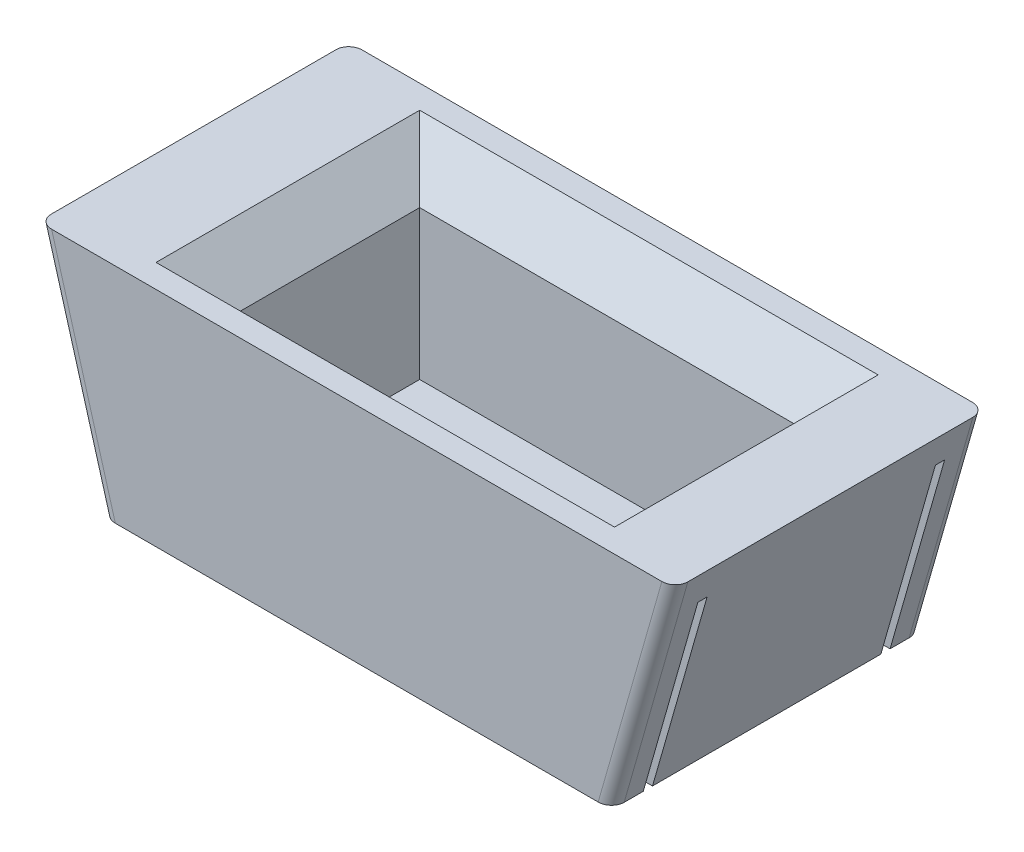
ISO-10303-21;
HEADER;
FILE_DESCRIPTION(('STEP AP214'),'2;1');
FILE_NAME('part.step','',(''),(''),'','','');
FILE_SCHEMA(('AUTOMOTIVE_DESIGN { 1 0 10303 214 1 1 1 1 }'));
ENDSEC;
DATA;
#1=APPLICATION_CONTEXT('core data for automotive mechanical design processes');
#2=APPLICATION_PROTOCOL_DEFINITION('international standard','automotive_design',2000,#1);
#3=PRODUCT_CONTEXT('',#1,'mechanical');
#4=PRODUCT('Part','Part','',(#3));
#5=PRODUCT_RELATED_PRODUCT_CATEGORY('part','',(#4));
#6=PRODUCT_DEFINITION_FORMATION('','',#4);
#7=PRODUCT_DEFINITION_CONTEXT('part definition',#1,'design');
#8=PRODUCT_DEFINITION('design','',#6,#7);
#9=PRODUCT_DEFINITION_SHAPE('','',#8);
#10=(LENGTH_UNIT() NAMED_UNIT(*) SI_UNIT(.MILLI.,.METRE.));
#11=(NAMED_UNIT(*) PLANE_ANGLE_UNIT() SI_UNIT($,.RADIAN.));
#12=(NAMED_UNIT(*) SI_UNIT($,.STERADIAN.) SOLID_ANGLE_UNIT());
#13=UNCERTAINTY_MEASURE_WITH_UNIT(LENGTH_MEASURE(1.E-05),#10,'distance_accuracy_value','');
#14=(GEOMETRIC_REPRESENTATION_CONTEXT(3) GLOBAL_UNCERTAINTY_ASSIGNED_CONTEXT((#13)) GLOBAL_UNIT_ASSIGNED_CONTEXT((#10,
#11,#12)) REPRESENTATION_CONTEXT('',''));
#15=CARTESIAN_POINT('',(0.,0.,0.));
#16=DIRECTION('',(0.,0.,1.));
#17=DIRECTION('',(1.,0.,0.));
#18=AXIS2_PLACEMENT_3D('',#15,#16,#17);
#19=CARTESIAN_POINT('',(0.,0.,0.));
#20=DIRECTION('',(0.,1.,0.));
#21=DIRECTION('',(0.,0.,1.));
#22=AXIS2_PLACEMENT_3D('',#19,#20,#21);
#23=PLANE('',#22);
#24=DIRECTION('',(0.,0.,1.));
#25=VECTOR('',#24,1.);
#26=CARTESIAN_POINT('',(-7.7566470171623,0.,11.5914147439107));
#27=LINE('',#26,#25);
#28=CARTESIAN_POINT('',(-7.7566470171623,0.,-14.1314147439107));
#29=VERTEX_POINT('',#28);
#30=CARTESIAN_POINT('',(-7.7566470171623,0.,14.1314147439107));
#31=VERTEX_POINT('',#30);
#32=EDGE_CURVE('E533',#29,#31,#27,.T.);
#33=ORIENTED_EDGE('',*,*,#32,.T.);
#34=DIRECTION('',(1.,0.,0.));
#35=VECTOR('',#34,1.);
#36=CARTESIAN_POINT('',(0.,0.,14.1314147439107));
#37=LINE('',#36,#35);
#38=CARTESIAN_POINT('',(32.766,0.,14.1314147439107));
#39=VERTEX_POINT('',#38);
#40=EDGE_CURVE('E536',#31,#39,#37,.T.);
#41=ORIENTED_EDGE('',*,*,#40,.T.);
#42=DIRECTION('',(0.,0.,-1.));
#43=VECTOR('',#42,1.);
#44=CARTESIAN_POINT('',(32.766,0.,0.));
#45=LINE('',#44,#43);
#46=CARTESIAN_POINT('',(32.766,0.,-14.1314147439107));
#47=VERTEX_POINT('',#46);
#48=EDGE_CURVE('E530',#39,#47,#45,.T.);
#49=ORIENTED_EDGE('',*,*,#48,.T.);
#50=DIRECTION('',(-1.,0.,0.));
#51=VECTOR('',#50,1.);
#52=CARTESIAN_POINT('',(-5.21664701716227,0.,-14.1314147439107));
#53=LINE('',#52,#51);
#54=EDGE_CURVE('E527',#47,#29,#53,.T.);
#55=ORIENTED_EDGE('',*,*,#54,.T.);
#56=EDGE_LOOP('',(#33,#41,#49,#55));
#57=FACE_BOUND('',#56,.T.);
#58=DIRECTION('',(1.,0.,0.));
#59=VECTOR('',#58,1.);
#60=CARTESIAN_POINT('',(0.,0.,22.7711));
#61=LINE('',#60,#59);
#62=CARTESIAN_POINT('',(-50.7954767943513,0.,22.7711));
#63=VERTEX_POINT('',#62);
#64=CARTESIAN_POINT('',(50.7954767943513,0.,22.7711));
#65=VERTEX_POINT('',#64);
#66=EDGE_CURVE('E386',#63,#65,#61,.T.);
#67=ORIENTED_EDGE('',*,*,#66,.F.);
#68=DIRECTION('',(0.,0.,1.));
#69=VECTOR('',#68,1.);
#70=CARTESIAN_POINT('',(-50.7954767943513,0.,-30.9626));
#71=LINE('',#70,#69);
#72=CARTESIAN_POINT('',(-50.7954767943513,0.,-22.7711));
#73=VERTEX_POINT('',#72);
#74=EDGE_CURVE('E327',#73,#63,#71,.T.);
#75=ORIENTED_EDGE('',*,*,#74,.F.);
#76=DIRECTION('',(1.,0.,0.));
#77=VECTOR('',#76,1.);
#78=CARTESIAN_POINT('',(0.,0.,-22.7711));
#79=LINE('',#78,#77);
#80=CARTESIAN_POINT('',(50.7954767943513,0.,-22.7711));
#81=VERTEX_POINT('',#80);
#82=EDGE_CURVE('E397',#73,#81,#79,.T.);
#83=ORIENTED_EDGE('',*,*,#82,.T.);
#84=DIRECTION('',(0.,0.,1.));
#85=VECTOR('',#84,1.);
#86=CARTESIAN_POINT('',(50.7954767943513,0.,-30.9626));
#87=LINE('',#86,#85);
#88=EDGE_CURVE('E332',#81,#65,#87,.T.);
#89=ORIENTED_EDGE('',*,*,#88,.T.);
#90=EDGE_LOOP('',(#67,#75,#83,#89));
#91=FACE_BOUND('',#90,.T.);
#92=ADVANCED_FACE('F76',(#57,#91),#23,.F.);
#93=DIRECTION('',(1.,0.,0.));
#94=VECTOR('',#93,1.);
#95=CARTESIAN_POINT('',(0.,0.,30.9626));
#96=LINE('',#95,#94);
#97=CARTESIAN_POINT('',(-48.1537659016846,0.,30.9626));
#98=VERTEX_POINT('',#97);
#99=CARTESIAN_POINT('',(48.1537659016846,0.,30.9626));
#100=VERTEX_POINT('',#99);
#101=EDGE_CURVE('E396',#98,#100,#96,.T.);
#102=ORIENTED_EDGE('',*,*,#101,.F.);
#103=CARTESIAN_POINT('',(-48.1537659016846,0.,28.4226));
#104=DIRECTION('',(0.,1.,0.));
#105=DIRECTION('',(-1.,0.,0.));
#106=AXIS2_PLACEMENT_3D('',#103,#104,#105);
#107=ELLIPSE('',#106,2.64171089266669,2.54);
#108=CARTESIAN_POINT('',(-50.7954767943513,0.,28.4226));
#109=VERTEX_POINT('',#108);
#110=EDGE_CURVE('E504',#98,#109,#107,.F.);
#111=ORIENTED_EDGE('',*,*,#110,.T.);
#112=CARTESIAN_POINT('',(-50.7954767943513,0.,24.6126));
#113=VERTEX_POINT('',#112);
#114=EDGE_CURVE('E328',#113,#109,#71,.T.);
#115=ORIENTED_EDGE('',*,*,#114,.F.);
#116=DIRECTION('',(1.,0.,0.));
#117=VECTOR('',#116,1.);
#118=CARTESIAN_POINT('',(0.,0.,24.6126));
#119=LINE('',#118,#117);
#120=CARTESIAN_POINT('',(50.7954767943513,0.,24.6126));
#121=VERTEX_POINT('',#120);
#122=EDGE_CURVE('E409',#113,#121,#119,.T.);
#123=ORIENTED_EDGE('',*,*,#122,.T.);
#124=CARTESIAN_POINT('',(50.7954767943513,0.,28.4226));
#125=VERTEX_POINT('',#124);
#126=EDGE_CURVE('E322',#121,#125,#87,.T.);
#127=ORIENTED_EDGE('',*,*,#126,.T.);
#128=CARTESIAN_POINT('',(48.1537659016846,0.,28.4226));
#129=DIRECTION('',(0.,1.,0.));
#130=DIRECTION('',(-1.,0.,0.));
#131=AXIS2_PLACEMENT_3D('',#128,#129,#130);
#132=ELLIPSE('',#131,2.64171089266669,2.54);
#133=EDGE_CURVE('E501',#125,#100,#132,.F.);
#134=ORIENTED_EDGE('',*,*,#133,.T.);
#135=EDGE_LOOP('',(#102,#111,#115,#123,#127,#134));
#136=FACE_BOUND('',#135,.T.);
#137=ADVANCED_FACE('F591',(#136),#23,.F.);
#138=CARTESIAN_POINT('',(0.,44.45,-30.9626));
#139=DIRECTION('',(0.,0.,-1.));
#140=DIRECTION('',(-1.,0.,0.));
#141=AXIS2_PLACEMENT_3D('',#138,#139,#140);
#142=PLANE('',#141);
#143=DIRECTION('',(1.,0.,0.));
#144=VECTOR('',#143,1.);
#145=CARTESIAN_POINT('',(0.,0.,-30.9626));
#146=LINE('',#145,#144);
#147=CARTESIAN_POINT('',(-48.1537659016846,0.,-30.9626));
#148=VERTEX_POINT('',#147);
#149=CARTESIAN_POINT('',(48.1537659016846,0.,-30.9626));
#150=VERTEX_POINT('',#149);
#151=EDGE_CURVE('E424',#148,#150,#146,.T.);
#152=ORIENTED_EDGE('',*,*,#151,.F.);
#153=DIRECTION('',(-0.27481158389579,0.961498098467536,0.));
#154=VECTOR('',#153,1.);
#155=CARTESIAN_POINT('',(-61.0577948298924,45.1480214230953,-30.9626));
#156=LINE('',#155,#154);
#157=CARTESIAN_POINT('',(-60.8582891073333,44.45,-30.9626));
#158=VERTEX_POINT('',#157);
#159=EDGE_CURVE('E510',#148,#158,#156,.T.);
#160=ORIENTED_EDGE('',*,*,#159,.T.);
#161=DIRECTION('',(1.,0.,0.));
#162=VECTOR('',#161,1.);
#163=CARTESIAN_POINT('',(0.,44.45,-30.9626));
#164=LINE('',#163,#162);
#165=CARTESIAN_POINT('',(60.8582891073333,44.45,-30.9626));
#166=VERTEX_POINT('',#165);
#167=EDGE_CURVE('E423',#158,#166,#164,.T.);
#168=ORIENTED_EDGE('',*,*,#167,.T.);
#169=DIRECTION('',(0.274811583895791,0.961498098467536,0.));
#170=VECTOR('',#169,1.);
#171=CARTESIAN_POINT('',(56.2621855080421,28.3693646482017,-30.9626));
#172=LINE('',#171,#170);
#173=EDGE_CURVE('E507',#166,#150,#172,.F.);
#174=ORIENTED_EDGE('',*,*,#173,.T.);
#175=EDGE_LOOP('',(#152,#160,#168,#174));
#176=FACE_BOUND('',#175,.T.);
#177=ADVANCED_FACE('F650',(#176),#142,.T.);
#178=CARTESIAN_POINT('',(-50.7954767943513,0.,-28.4226));
#179=VERTEX_POINT('',#178);
#180=CARTESIAN_POINT('',(-50.7954767943513,0.,-24.6126));
#181=VERTEX_POINT('',#180);
#182=EDGE_CURVE('E323',#179,#181,#71,.T.);
#183=ORIENTED_EDGE('',*,*,#182,.F.);
#184=CARTESIAN_POINT('',(-48.1537659016846,0.,-28.4226));
#185=DIRECTION('',(0.,1.,0.));
#186=DIRECTION('',(1.,0.,0.));
#187=AXIS2_PLACEMENT_3D('',#184,#185,#186);
#188=ELLIPSE('',#187,2.64171089266669,2.54);
#189=EDGE_CURVE('E517',#179,#148,#188,.F.);
#190=ORIENTED_EDGE('',*,*,#189,.T.);
#191=ORIENTED_EDGE('',*,*,#151,.T.);
#192=CARTESIAN_POINT('',(48.1537659016846,0.,-28.4226));
#193=DIRECTION('',(0.,1.,0.));
#194=DIRECTION('',(1.,0.,0.));
#195=AXIS2_PLACEMENT_3D('',#192,#193,#194);
#196=ELLIPSE('',#195,2.64171089266669,2.54);
#197=CARTESIAN_POINT('',(50.7954767943513,0.,-28.4226));
#198=VERTEX_POINT('',#197);
#199=EDGE_CURVE('E514',#150,#198,#196,.F.);
#200=ORIENTED_EDGE('',*,*,#199,.T.);
#201=CARTESIAN_POINT('',(50.7954767943513,0.,-24.6126));
#202=VERTEX_POINT('',#201);
#203=EDGE_CURVE('E329',#198,#202,#87,.T.);
#204=ORIENTED_EDGE('',*,*,#203,.T.);
#205=DIRECTION('',(1.,0.,0.));
#206=VECTOR('',#205,1.);
#207=CARTESIAN_POINT('',(0.,0.,-24.6126));
#208=LINE('',#207,#206);
#209=EDGE_CURVE('E392',#181,#202,#208,.T.);
#210=ORIENTED_EDGE('',*,*,#209,.F.);
#211=EDGE_LOOP('',(#183,#190,#191,#200,#204,#210));
#212=FACE_BOUND('',#211,.T.);
#213=ADVANCED_FACE('F593',(#212),#23,.F.);
#214=CARTESIAN_POINT('',(0.,44.45,30.9626));
#215=DIRECTION('',(0.,0.,-1.));
#216=DIRECTION('',(-1.,0.,0.));
#217=AXIS2_PLACEMENT_3D('',#214,#215,#216);
#218=PLANE('',#217);
#219=DIRECTION('',(1.,0.,0.));
#220=VECTOR('',#219,1.);
#221=CARTESIAN_POINT('',(0.,44.45,30.9626));
#222=LINE('',#221,#220);
#223=CARTESIAN_POINT('',(-60.8582891073333,44.45,30.9626));
#224=VERTEX_POINT('',#223);
#225=CARTESIAN_POINT('',(60.8582891073333,44.45,30.9626));
#226=VERTEX_POINT('',#225);
#227=EDGE_CURVE('E436',#224,#226,#222,.T.);
#228=ORIENTED_EDGE('',*,*,#227,.F.);
#229=DIRECTION('',(-0.27481158389579,0.961498098467536,0.));
#230=VECTOR('',#229,1.);
#231=CARTESIAN_POINT('',(-56.2621855080421,28.3693646482018,30.9626));
#232=LINE('',#231,#230);
#233=EDGE_CURVE('E498',#224,#98,#232,.F.);
#234=ORIENTED_EDGE('',*,*,#233,.T.);
#235=ORIENTED_EDGE('',*,*,#101,.T.);
#236=DIRECTION('',(0.274811583895791,0.961498098467536,0.));
#237=VECTOR('',#236,1.);
#238=CARTESIAN_POINT('',(61.0577948298925,45.1480214230953,30.9626));
#239=LINE('',#238,#237);
#240=EDGE_CURVE('E494',#100,#226,#239,.T.);
#241=ORIENTED_EDGE('',*,*,#240,.T.);
#242=EDGE_LOOP('',(#228,#234,#235,#241));
#243=FACE_BOUND('',#242,.T.);
#244=ADVANCED_FACE('F631',(#243),#218,.F.);
#245=CARTESIAN_POINT('',(0.,38.1,22.7711));
#246=DIRECTION('',(0.,0.,-1.));
#247=DIRECTION('',(-1.,0.,0.));
#248=AXIS2_PLACEMENT_3D('',#245,#246,#247);
#249=PLANE('',#248);
#250=DIRECTION('',(1.,0.,0.));
#251=VECTOR('',#250,1.);
#252=CARTESIAN_POINT('',(0.,38.1,22.7711));
#253=LINE('',#252,#251);
#254=CARTESIAN_POINT('',(-61.6850681134787,38.1,22.7711));
#255=VERTEX_POINT('',#254);
#256=CARTESIAN_POINT('',(61.6850681134788,38.1,22.7711));
#257=VERTEX_POINT('',#256);
#258=EDGE_CURVE('E405',#255,#257,#253,.T.);
#259=ORIENTED_EDGE('',*,*,#258,.F.);
#260=DIRECTION('',(0.27481158389579,-0.961498098467536,0.));
#261=VECTOR('',#260,1.);
#262=CARTESIAN_POINT('',(-57.0265250006602,21.8009041572915,22.7711));
#263=LINE('',#262,#261);
#264=EDGE_CURVE('E364',#255,#63,#263,.T.);
#265=ORIENTED_EDGE('',*,*,#264,.T.);
#266=ORIENTED_EDGE('',*,*,#66,.T.);
#267=DIRECTION('',(-0.274811583895791,-0.961498098467536,0.));
#268=VECTOR('',#267,1.);
#269=CARTESIAN_POINT('',(57.0265250006602,21.8009041572915,22.7711));
#270=LINE('',#269,#268);
#271=EDGE_CURVE('E347',#257,#65,#270,.T.);
#272=ORIENTED_EDGE('',*,*,#271,.F.);
#273=EDGE_LOOP('',(#259,#265,#266,#272));
#274=FACE_BOUND('',#273,.T.);
#275=ADVANCED_FACE('F601',(#274),#249,.F.);
#276=CARTESIAN_POINT('',(0.,38.1,24.6126));
#277=DIRECTION('',(0.,0.,-1.));
#278=DIRECTION('',(-1.,0.,0.));
#279=AXIS2_PLACEMENT_3D('',#276,#277,#278);
#280=PLANE('',#279);
#281=DIRECTION('',(0.27481158389579,-0.961498098467536,0.));
#282=VECTOR('',#281,1.);
#283=CARTESIAN_POINT('',(-57.0265250006602,21.8009041572915,24.6126));
#284=LINE('',#283,#282);
#285=CARTESIAN_POINT('',(-61.6850681134787,38.1,24.6126));
#286=VERTEX_POINT('',#285);
#287=EDGE_CURVE('E361',#286,#113,#284,.T.);
#288=ORIENTED_EDGE('',*,*,#287,.F.);
#289=DIRECTION('',(1.,0.,0.));
#290=VECTOR('',#289,1.);
#291=CARTESIAN_POINT('',(0.,38.1,24.6126));
#292=LINE('',#291,#290);
#293=CARTESIAN_POINT('',(61.6850681134788,38.1,24.6126));
#294=VERTEX_POINT('',#293);
#295=EDGE_CURVE('E401',#286,#294,#292,.T.);
#296=ORIENTED_EDGE('',*,*,#295,.T.);
#297=DIRECTION('',(-0.274811583895791,-0.961498098467536,0.));
#298=VECTOR('',#297,1.);
#299=CARTESIAN_POINT('',(57.0265250006602,21.8009041572915,24.6126));
#300=LINE('',#299,#298);
#301=EDGE_CURVE('E343',#294,#121,#300,.T.);
#302=ORIENTED_EDGE('',*,*,#301,.T.);
#303=ORIENTED_EDGE('',*,*,#122,.F.);
#304=EDGE_LOOP('',(#288,#296,#302,#303));
#305=FACE_BOUND('',#304,.T.);
#306=ADVANCED_FACE('F611',(#305),#280,.T.);
#307=CARTESIAN_POINT('',(0.,38.1,0.));
#308=DIRECTION('',(0.,1.,0.));
#309=DIRECTION('',(0.,0.,1.));
#310=AXIS2_PLACEMENT_3D('',#307,#308,#309);
#311=PLANE('',#310);
#312=ORIENTED_EDGE('',*,*,#295,.F.);
#313=DIRECTION('',(0.,0.,-1.));
#314=VECTOR('',#313,1.);
#315=CARTESIAN_POINT('',(-61.6850681134787,38.1,0.));
#316=LINE('',#315,#314);
#317=EDGE_CURVE('E357',#286,#255,#316,.T.);
#318=ORIENTED_EDGE('',*,*,#317,.T.);
#319=ORIENTED_EDGE('',*,*,#258,.T.);
#320=DIRECTION('',(0.,0.,-1.));
#321=VECTOR('',#320,1.);
#322=CARTESIAN_POINT('',(61.6850681134788,38.1,0.));
#323=LINE('',#322,#321);
#324=EDGE_CURVE('E340',#294,#257,#323,.T.);
#325=ORIENTED_EDGE('',*,*,#324,.F.);
#326=EDGE_LOOP('',(#312,#318,#319,#325));
#327=FACE_BOUND('',#326,.T.);
#328=ADVANCED_FACE('F608',(#327),#311,.F.);
#329=CARTESIAN_POINT('',(0.,38.1,-22.7711));
#330=DIRECTION('',(0.,0.,-1.));
#331=DIRECTION('',(-1.,0.,0.));
#332=AXIS2_PLACEMENT_3D('',#329,#330,#331);
#333=PLANE('',#332);
#334=DIRECTION('',(0.27481158389579,-0.961498098467536,0.));
#335=VECTOR('',#334,1.);
#336=CARTESIAN_POINT('',(-57.0265250006602,21.8009041572915,-22.7711));
#337=LINE('',#336,#335);
#338=CARTESIAN_POINT('',(-61.6850681134787,38.1,-22.7711));
#339=VERTEX_POINT('',#338);
#340=EDGE_CURVE('E354',#339,#73,#337,.T.);
#341=ORIENTED_EDGE('',*,*,#340,.F.);
#342=DIRECTION('',(1.,0.,0.));
#343=VECTOR('',#342,1.);
#344=CARTESIAN_POINT('',(0.,38.1,-22.7711));
#345=LINE('',#344,#343);
#346=CARTESIAN_POINT('',(61.6850681134788,38.1,-22.7711));
#347=VERTEX_POINT('',#346);
#348=EDGE_CURVE('E387',#339,#347,#345,.T.);
#349=ORIENTED_EDGE('',*,*,#348,.T.);
#350=DIRECTION('',(-0.274811583895791,-0.961498098467536,0.));
#351=VECTOR('',#350,1.);
#352=CARTESIAN_POINT('',(57.0265250006602,21.8009041572915,-22.7711));
#353=LINE('',#352,#351);
#354=EDGE_CURVE('E336',#347,#81,#353,.T.);
#355=ORIENTED_EDGE('',*,*,#354,.T.);
#356=ORIENTED_EDGE('',*,*,#82,.F.);
#357=EDGE_LOOP('',(#341,#349,#355,#356));
#358=FACE_BOUND('',#357,.T.);
#359=ADVANCED_FACE('F668',(#358),#333,.T.);
#360=CARTESIAN_POINT('',(0.,38.1,-24.6126));
#361=DIRECTION('',(0.,0.,-1.));
#362=DIRECTION('',(-1.,0.,0.));
#363=AXIS2_PLACEMENT_3D('',#360,#361,#362);
#364=PLANE('',#363);
#365=DIRECTION('',(1.,0.,0.));
#366=VECTOR('',#365,1.);
#367=CARTESIAN_POINT('',(0.,38.1,-24.6126));
#368=LINE('',#367,#366);
#369=CARTESIAN_POINT('',(-61.6850681134787,38.1,-24.6126));
#370=VERTEX_POINT('',#369);
#371=CARTESIAN_POINT('',(61.6850681134788,38.1,-24.6126));
#372=VERTEX_POINT('',#371);
#373=EDGE_CURVE('E391',#370,#372,#368,.T.);
#374=ORIENTED_EDGE('',*,*,#373,.F.);
#375=DIRECTION('',(0.27481158389579,-0.961498098467536,0.));
#376=VECTOR('',#375,1.);
#377=CARTESIAN_POINT('',(-57.0265250006602,21.8009041572915,-24.6126));
#378=LINE('',#377,#376);
#379=EDGE_CURVE('E350',#370,#181,#378,.T.);
#380=ORIENTED_EDGE('',*,*,#379,.T.);
#381=ORIENTED_EDGE('',*,*,#209,.T.);
#382=DIRECTION('',(-0.274811583895791,-0.961498098467536,0.));
#383=VECTOR('',#382,1.);
#384=CARTESIAN_POINT('',(57.0265250006602,21.8009041572915,-24.6126));
#385=LINE('',#384,#383);
#386=EDGE_CURVE('E326',#372,#202,#385,.T.);
#387=ORIENTED_EDGE('',*,*,#386,.F.);
#388=EDGE_LOOP('',(#374,#380,#381,#387));
#389=FACE_BOUND('',#388,.T.);
#390=ADVANCED_FACE('F662',(#389),#364,.F.);
#391=CARTESIAN_POINT('',(0.,38.1,0.));
#392=DIRECTION('',(0.,1.,0.));
#393=DIRECTION('',(0.,0.,1.));
#394=AXIS2_PLACEMENT_3D('',#391,#392,#393);
#395=PLANE('',#394);
#396=ORIENTED_EDGE('',*,*,#348,.F.);
#397=DIRECTION('',(0.,0.,-1.));
#398=VECTOR('',#397,1.);
#399=CARTESIAN_POINT('',(-61.6850681134787,38.1,0.));
#400=LINE('',#399,#398);
#401=EDGE_CURVE('E471',#339,#370,#400,.T.);
#402=ORIENTED_EDGE('',*,*,#401,.T.);
#403=ORIENTED_EDGE('',*,*,#373,.T.);
#404=DIRECTION('',(0.,0.,-1.));
#405=VECTOR('',#404,1.);
#406=CARTESIAN_POINT('',(61.6850681134788,38.1,0.));
#407=LINE('',#406,#405);
#408=EDGE_CURVE('E456',#347,#372,#407,.T.);
#409=ORIENTED_EDGE('',*,*,#408,.F.);
#410=EDGE_LOOP('',(#396,#402,#403,#409));
#411=FACE_BOUND('',#410,.T.);
#412=ADVANCED_FACE('F666',(#411),#395,.F.);
#413=CARTESIAN_POINT('',(0.,44.45,0.));
#414=DIRECTION('',(0.,1.,0.));
#415=DIRECTION('',(0.,0.,1.));
#416=AXIS2_PLACEMENT_3D('',#413,#414,#415);
#417=PLANE('',#416);
#418=DIRECTION('',(-1.,0.,0.));
#419=VECTOR('',#418,1.);
#420=CARTESIAN_POINT('',(-34.544,44.45,26.289));
#421=LINE('',#420,#419);
#422=CARTESIAN_POINT('',(46.736,44.45,26.289));
#423=VERTEX_POINT('',#422);
#424=CARTESIAN_POINT('',(-44.704,44.45,26.289));
#425=VERTEX_POINT('',#424);
#426=EDGE_CURVE('E449',#423,#425,#421,.T.);
#427=ORIENTED_EDGE('',*,*,#426,.T.);
#428=DIRECTION('',(0.,0.,-1.));
#429=VECTOR('',#428,1.);
#430=CARTESIAN_POINT('',(-44.704,44.45,-16.129));
#431=LINE('',#430,#429);
#432=CARTESIAN_POINT('',(-44.704,44.45,-26.289));
#433=VERTEX_POINT('',#432);
#434=EDGE_CURVE('E452',#425,#433,#431,.T.);
#435=ORIENTED_EDGE('',*,*,#434,.T.);
#436=DIRECTION('',(1.,0.,0.));
#437=VECTOR('',#436,1.);
#438=CARTESIAN_POINT('',(36.576,44.45,-26.289));
#439=LINE('',#438,#437);
#440=CARTESIAN_POINT('',(46.736,44.45,-26.289));
#441=VERTEX_POINT('',#440);
#442=EDGE_CURVE('E445',#433,#441,#439,.T.);
#443=ORIENTED_EDGE('',*,*,#442,.T.);
#444=DIRECTION('',(0.,0.,1.));
#445=VECTOR('',#444,1.);
#446=CARTESIAN_POINT('',(46.736,44.45,16.129));
#447=LINE('',#446,#445);
#448=EDGE_CURVE('E432',#441,#423,#447,.T.);
#449=ORIENTED_EDGE('',*,*,#448,.T.);
#450=EDGE_LOOP('',(#427,#435,#443,#449));
#451=FACE_BOUND('',#450,.T.);
#452=DIRECTION('',(0.,0.,-1.));
#453=VECTOR('',#452,1.);
#454=CARTESIAN_POINT('',(-63.5,44.45,0.));
#455=LINE('',#454,#453);
#456=CARTESIAN_POINT('',(-63.5,44.45,28.4226));
#457=VERTEX_POINT('',#456);
#458=CARTESIAN_POINT('',(-63.5,44.45,-28.4226));
#459=VERTEX_POINT('',#458);
#460=EDGE_CURVE('E428',#457,#459,#455,.T.);
#461=ORIENTED_EDGE('',*,*,#460,.F.);
#462=CARTESIAN_POINT('',(-60.8582891073333,44.45,28.4226));
#463=DIRECTION('',(0.,1.,0.));
#464=DIRECTION('',(-1.,0.,0.));
#465=AXIS2_PLACEMENT_3D('',#462,#463,#464);
#466=ELLIPSE('',#465,2.64171089266669,2.54);
#467=EDGE_CURVE('E491',#457,#224,#466,.T.);
#468=ORIENTED_EDGE('',*,*,#467,.T.);
#469=ORIENTED_EDGE('',*,*,#227,.T.);
#470=CARTESIAN_POINT('',(60.8582891073333,44.45,28.4226));
#471=DIRECTION('',(0.,1.,0.));
#472=DIRECTION('',(-1.,0.,0.));
#473=AXIS2_PLACEMENT_3D('',#470,#471,#472);
#474=ELLIPSE('',#473,2.64171089266669,2.54);
#475=CARTESIAN_POINT('',(63.5,44.45,28.4226));
#476=VERTEX_POINT('',#475);
#477=EDGE_CURVE('E482',#226,#476,#474,.T.);
#478=ORIENTED_EDGE('',*,*,#477,.T.);
#479=DIRECTION('',(0.,0.,-1.));
#480=VECTOR('',#479,1.);
#481=CARTESIAN_POINT('',(63.5,44.45,0.));
#482=LINE('',#481,#480);
#483=CARTESIAN_POINT('',(63.5,44.45,-28.4226));
#484=VERTEX_POINT('',#483);
#485=EDGE_CURVE('E419',#476,#484,#482,.T.);
#486=ORIENTED_EDGE('',*,*,#485,.T.);
#487=CARTESIAN_POINT('',(60.8582891073333,44.45,-28.4226));
#488=DIRECTION('',(0.,1.,0.));
#489=DIRECTION('',(1.,0.,0.));
#490=AXIS2_PLACEMENT_3D('',#487,#488,#489);
#491=ELLIPSE('',#490,2.64171089266669,2.54);
#492=EDGE_CURVE('E485',#484,#166,#491,.T.);
#493=ORIENTED_EDGE('',*,*,#492,.T.);
#494=ORIENTED_EDGE('',*,*,#167,.F.);
#495=CARTESIAN_POINT('',(-60.8582891073333,44.45,-28.4226));
#496=DIRECTION('',(0.,1.,0.));
#497=DIRECTION('',(1.,0.,0.));
#498=AXIS2_PLACEMENT_3D('',#495,#496,#497);
#499=ELLIPSE('',#498,2.64171089266669,2.54);
#500=EDGE_CURVE('E488',#158,#459,#499,.T.);
#501=ORIENTED_EDGE('',*,*,#500,.T.);
#502=EDGE_LOOP('',(#461,#468,#469,#478,#486,#493,#494,#501));
#503=FACE_BOUND('',#502,.T.);
#504=ADVANCED_FACE('F635',(#451,#503),#417,.T.);
#505=CARTESIAN_POINT('',(0.,6.34999999999999,0.));
#506=DIRECTION('',(0.,-1.,0.));
#507=DIRECTION('',(0.,0.,-1.));
#508=AXIS2_PLACEMENT_3D('',#505,#506,#507);
#509=PLANE('',#508);
#510=DIRECTION('',(0.,0.,-1.));
#511=VECTOR('',#510,1.);
#512=CARTESIAN_POINT('',(30.226,6.34999999999999,11.5914147439107));
#513=LINE('',#512,#511);
#514=CARTESIAN_POINT('',(30.226,6.34999999999999,11.5914147439107));
#515=VERTEX_POINT('',#514);
#516=CARTESIAN_POINT('',(30.226,6.34999999999999,-11.5914147439107));
#517=VERTEX_POINT('',#516);
#518=EDGE_CURVE('E369',#515,#517,#513,.T.);
#519=ORIENTED_EDGE('',*,*,#518,.F.);
#520=DIRECTION('',(1.,0.,0.));
#521=VECTOR('',#520,1.);
#522=CARTESIAN_POINT('',(-5.21664701716227,6.34999999999999,11.5914147439107));
#523=LINE('',#522,#521);
#524=CARTESIAN_POINT('',(-5.21664701716227,6.34999999999999,11.5914147439107));
#525=VERTEX_POINT('',#524);
#526=EDGE_CURVE('E382',#525,#515,#523,.T.);
#527=ORIENTED_EDGE('',*,*,#526,.F.);
#528=DIRECTION('',(0.,0.,1.));
#529=VECTOR('',#528,1.);
#530=CARTESIAN_POINT('',(-5.21664701716227,6.34999999999999,11.5914147439107));
#531=LINE('',#530,#529);
#532=CARTESIAN_POINT('',(-5.21664701716227,6.34999999999999,-11.5914147439107));
#533=VERTEX_POINT('',#532);
#534=EDGE_CURVE('E378',#533,#525,#531,.T.);
#535=ORIENTED_EDGE('',*,*,#534,.F.);
#536=DIRECTION('',(-1.,0.,0.));
#537=VECTOR('',#536,1.);
#538=CARTESIAN_POINT('',(-5.21664701716227,6.34999999999999,-11.5914147439107));
#539=LINE('',#538,#537);
#540=EDGE_CURVE('E373',#517,#533,#539,.T.);
#541=ORIENTED_EDGE('',*,*,#540,.F.);
#542=EDGE_LOOP('',(#519,#527,#535,#541));
#543=FACE_BOUND('',#542,.T.);
#544=DIRECTION('',(-1.,0.,0.));
#545=VECTOR('',#544,1.);
#546=CARTESIAN_POINT('',(-36.294,6.34999999999999,-17.879));
#547=LINE('',#546,#545);
#548=CARTESIAN_POINT('',(38.326,6.34999999999999,-17.879));
#549=VERTEX_POINT('',#548);
#550=CARTESIAN_POINT('',(-36.294,6.34999999999999,-17.879));
#551=VERTEX_POINT('',#550);
#552=EDGE_CURVE('E282',#549,#551,#547,.T.);
#553=ORIENTED_EDGE('',*,*,#552,.T.);
#554=DIRECTION('',(0.,0.,1.));
#555=VECTOR('',#554,1.);
#556=CARTESIAN_POINT('',(-36.294,6.34999999999999,-17.879));
#557=LINE('',#556,#555);
#558=CARTESIAN_POINT('',(-36.294,6.34999999999999,17.879));
#559=VERTEX_POINT('',#558);
#560=EDGE_CURVE('E276',#551,#559,#557,.T.);
#561=ORIENTED_EDGE('',*,*,#560,.T.);
#562=DIRECTION('',(1.,0.,0.));
#563=VECTOR('',#562,1.);
#564=CARTESIAN_POINT('',(-36.294,6.34999999999999,17.879));
#565=LINE('',#564,#563);
#566=CARTESIAN_POINT('',(38.326,6.34999999999999,17.879));
#567=VERTEX_POINT('',#566);
#568=EDGE_CURVE('E263',#559,#567,#565,.T.);
#569=ORIENTED_EDGE('',*,*,#568,.T.);
#570=DIRECTION('',(0.,0.,-1.));
#571=VECTOR('',#570,1.);
#572=CARTESIAN_POINT('',(38.326,6.34999999999999,-17.879));
#573=LINE('',#572,#571);
#574=EDGE_CURVE('E289',#567,#549,#573,.T.);
#575=ORIENTED_EDGE('',*,*,#574,.T.);
#576=EDGE_LOOP('',(#553,#561,#569,#575));
#577=FACE_BOUND('',#576,.T.);
#578=ADVANCED_FACE('F281',(#543,#577),#509,.F.);
#579=CARTESIAN_POINT('',(36.576,34.29,16.129));
#580=DIRECTION('',(-0.707106781186547,0.707106781186548,0.));
#581=DIRECTION('',(0.,0.,1.));
#582=AXIS2_PLACEMENT_3D('',#579,#580,#581);
#583=PLANE('',#582);
#584=DIRECTION('',(0.,0.,-1.));
#585=VECTOR('',#584,1.);
#586=CARTESIAN_POINT('',(38.326,36.04,16.129));
#587=LINE('',#586,#585);
#588=CARTESIAN_POINT('',(38.326,36.04,17.879));
#589=VERTEX_POINT('',#588);
#590=CARTESIAN_POINT('',(38.326,36.04,-17.879));
#591=VERTEX_POINT('',#590);
#592=EDGE_CURVE('E305',#589,#591,#587,.T.);
#593=ORIENTED_EDGE('',*,*,#592,.F.);
#594=DIRECTION('',(0.577350269189626,0.577350269189625,0.577350269189626));
#595=VECTOR('',#594,1.);
#596=CARTESIAN_POINT('',(12.8693333333333,10.5833333333334,-7.5776666666667));
#597=LINE('',#596,#595);
#598=EDGE_CURVE('E463',#423,#589,#597,.F.);
#599=ORIENTED_EDGE('',*,*,#598,.F.);
#600=ORIENTED_EDGE('',*,*,#448,.F.);
#601=DIRECTION('',(-0.577350269189626,-0.577350269189625,0.577350269189626));
#602=VECTOR('',#601,1.);
#603=CARTESIAN_POINT('',(12.8693333333333,10.5833333333334,7.5776666666667));
#604=LINE('',#603,#602);
#605=EDGE_CURVE('E374',#591,#441,#604,.F.);
#606=ORIENTED_EDGE('',*,*,#605,.F.);
#607=EDGE_LOOP('',(#593,#599,#600,#606));
#608=FACE_BOUND('',#607,.T.);
#609=ADVANCED_FACE('F711',(#608),#583,.T.);
#610=CARTESIAN_POINT('',(-34.544,34.29,-16.129));
#611=DIRECTION('',(0.,0.707106781186548,0.707106781186547));
#612=DIRECTION('',(1.,0.,0.));
#613=AXIS2_PLACEMENT_3D('',#610,#611,#612);
#614=PLANE('',#613);
#615=DIRECTION('',(-1.,0.,0.));
#616=VECTOR('',#615,1.);
#617=CARTESIAN_POINT('',(-34.544,36.04,-17.879));
#618=LINE('',#617,#616);
#619=CARTESIAN_POINT('',(-36.294,36.04,-17.879));
#620=VERTEX_POINT('',#619);
#621=EDGE_CURVE('E299',#591,#620,#618,.T.);
#622=ORIENTED_EDGE('',*,*,#621,.F.);
#623=ORIENTED_EDGE('',*,*,#605,.T.);
#624=ORIENTED_EDGE('',*,*,#442,.F.);
#625=DIRECTION('',(0.577350269189626,-0.577350269189625,0.577350269189626));
#626=VECTOR('',#625,1.);
#627=CARTESIAN_POINT('',(-34.544,34.29,-16.129));
#628=LINE('',#627,#626);
#629=EDGE_CURVE('E460',#620,#433,#628,.F.);
#630=ORIENTED_EDGE('',*,*,#629,.F.);
#631=EDGE_LOOP('',(#622,#623,#624,#630));
#632=FACE_BOUND('',#631,.T.);
#633=ADVANCED_FACE('F704',(#632),#614,.T.);
#634=CARTESIAN_POINT('',(-34.544,34.29,16.129));
#635=DIRECTION('',(0.,0.707106781186548,-0.707106781186547));
#636=DIRECTION('',(-1.,0.,0.));
#637=AXIS2_PLACEMENT_3D('',#634,#635,#636);
#638=PLANE('',#637);
#639=DIRECTION('',(1.,0.,0.));
#640=VECTOR('',#639,1.);
#641=CARTESIAN_POINT('',(-34.544,36.04,17.879));
#642=LINE('',#641,#640);
#643=CARTESIAN_POINT('',(-36.294,36.04,17.879));
#644=VERTEX_POINT('',#643);
#645=EDGE_CURVE('E302',#644,#589,#642,.T.);
#646=ORIENTED_EDGE('',*,*,#645,.F.);
#647=DIRECTION('',(-0.577350269189626,0.577350269189625,0.577350269189626));
#648=VECTOR('',#647,1.);
#649=CARTESIAN_POINT('',(-23.7913333333333,23.5373333333333,5.37633333333332));
#650=LINE('',#649,#648);
#651=EDGE_CURVE('E368',#425,#644,#650,.F.);
#652=ORIENTED_EDGE('',*,*,#651,.F.);
#653=ORIENTED_EDGE('',*,*,#426,.F.);
#654=ORIENTED_EDGE('',*,*,#598,.T.);
#655=EDGE_LOOP('',(#646,#652,#653,#654));
#656=FACE_BOUND('',#655,.T.);
#657=ADVANCED_FACE('F697',(#656),#638,.T.);
#658=CARTESIAN_POINT('',(-34.544,34.29,-16.129));
#659=DIRECTION('',(0.707106781186547,0.707106781186548,0.));
#660=DIRECTION('',(0.,0.,-1.));
#661=AXIS2_PLACEMENT_3D('',#658,#659,#660);
#662=PLANE('',#661);
#663=DIRECTION('',(0.,0.,1.));
#664=VECTOR('',#663,1.);
#665=CARTESIAN_POINT('',(-36.294,36.04,-16.129));
#666=LINE('',#665,#664);
#667=EDGE_CURVE('E12',#620,#644,#666,.T.);
#668=ORIENTED_EDGE('',*,*,#667,.F.);
#669=ORIENTED_EDGE('',*,*,#629,.T.);
#670=ORIENTED_EDGE('',*,*,#434,.F.);
#671=ORIENTED_EDGE('',*,*,#651,.T.);
#672=EDGE_LOOP('',(#668,#669,#670,#671));
#673=FACE_BOUND('',#672,.T.);
#674=ADVANCED_FACE('F691',(#673),#662,.T.);
#675=CARTESIAN_POINT('',(46.9593309357241,-13.4217302495983,-30.9626));
#676=DIRECTION('',(0.961498098467536,-0.274811583895791,0.));
#677=DIRECTION('',(0.274811583895791,0.961498098467536,0.));
#678=AXIS2_PLACEMENT_3D('',#675,#676,#677);
#679=PLANE('',#678);
#680=ORIENTED_EDGE('',*,*,#203,.F.);
#681=DIRECTION('',(0.274811583895791,0.961498098467536,0.));
#682=VECTOR('',#681,1.);
#683=CARTESIAN_POINT('',(46.9593309357241,-13.4217302495983,-28.4226));
#684=LINE('',#683,#682);
#685=EDGE_CURVE('E523',#198,#484,#684,.T.);
#686=ORIENTED_EDGE('',*,*,#685,.T.);
#687=ORIENTED_EDGE('',*,*,#485,.F.);
#688=DIRECTION('',(0.274811583895791,0.961498098467536,0.));
#689=VECTOR('',#688,1.);
#690=CARTESIAN_POINT('',(50.7954767943513,0.,28.4226));
#691=LINE('',#690,#689);
#692=EDGE_CURVE('E520',#476,#125,#691,.F.);
#693=ORIENTED_EDGE('',*,*,#692,.T.);
#694=ORIENTED_EDGE('',*,*,#126,.F.);
#695=ORIENTED_EDGE('',*,*,#301,.F.);
#696=ORIENTED_EDGE('',*,*,#324,.T.);
#697=ORIENTED_EDGE('',*,*,#271,.T.);
#698=ORIENTED_EDGE('',*,*,#88,.F.);
#699=ORIENTED_EDGE('',*,*,#354,.F.);
#700=ORIENTED_EDGE('',*,*,#408,.T.);
#701=ORIENTED_EDGE('',*,*,#386,.T.);
#702=EDGE_LOOP('',(#680,#686,#687,#693,#694,#695,#696,#697,#698,#699,#700,#701));
#703=FACE_BOUND('',#702,.T.);
#704=ADVANCED_FACE('F657',(#703),#679,.T.);
#705=CARTESIAN_POINT('',(-46.9593309357241,-13.4217302495983,-30.9626));
#706=DIRECTION('',(0.961498098467536,0.27481158389579,0.));
#707=DIRECTION('',(-0.27481158389579,0.961498098467536,0.));
#708=AXIS2_PLACEMENT_3D('',#705,#706,#707);
#709=PLANE('',#708);
#710=ORIENTED_EDGE('',*,*,#114,.T.);
#711=DIRECTION('',(-0.27481158389579,0.961498098467536,0.));
#712=VECTOR('',#711,1.);
#713=CARTESIAN_POINT('',(-46.9593309357241,-13.4217302495983,28.4226));
#714=LINE('',#713,#712);
#715=EDGE_CURVE('E478',#109,#457,#714,.T.);
#716=ORIENTED_EDGE('',*,*,#715,.T.);
#717=ORIENTED_EDGE('',*,*,#460,.T.);
#718=DIRECTION('',(-0.27481158389579,0.961498098467536,0.));
#719=VECTOR('',#718,1.);
#720=CARTESIAN_POINT('',(-50.7954767943513,0.,-28.4226));
#721=LINE('',#720,#719);
#722=EDGE_CURVE('E475',#459,#179,#721,.F.);
#723=ORIENTED_EDGE('',*,*,#722,.T.);
#724=ORIENTED_EDGE('',*,*,#182,.T.);
#725=ORIENTED_EDGE('',*,*,#379,.F.);
#726=ORIENTED_EDGE('',*,*,#401,.F.);
#727=ORIENTED_EDGE('',*,*,#340,.T.);
#728=ORIENTED_EDGE('',*,*,#74,.T.);
#729=ORIENTED_EDGE('',*,*,#264,.F.);
#730=ORIENTED_EDGE('',*,*,#317,.F.);
#731=ORIENTED_EDGE('',*,*,#287,.T.);
#732=EDGE_LOOP('',(#710,#716,#717,#723,#724,#725,#726,#727,#728,#729,#730,#731));
#733=FACE_BOUND('',#732,.T.);
#734=ADVANCED_FACE('F604',(#733),#709,.F.);
#735=CARTESIAN_POINT('',(-44.5171257656166,-12.723708826503,28.4226));
#736=DIRECTION('',(-0.27481158389579,0.961498098467536,0.));
#737=DIRECTION('',(-0.961498098467536,-0.27481158389579,0.));
#738=AXIS2_PLACEMENT_3D('',#735,#736,#737);
#739=CYLINDRICAL_SURFACE('',#738,2.54);
#740=ORIENTED_EDGE('',*,*,#110,.F.);
#741=ORIENTED_EDGE('',*,*,#233,.F.);
#742=ORIENTED_EDGE('',*,*,#467,.F.);
#743=ORIENTED_EDGE('',*,*,#715,.F.);
#744=EDGE_LOOP('',(#740,#741,#742,#743));
#745=FACE_BOUND('',#744,.T.);
#746=ADVANCED_FACE('F638',(#745),#739,.T.);
#747=CARTESIAN_POINT('',(-56.2621855080421,28.3693646482018,-28.4226));
#748=DIRECTION('',(0.27481158389579,-0.961498098467536,0.));
#749=DIRECTION('',(0.961498098467536,0.27481158389579,0.));
#750=AXIS2_PLACEMENT_3D('',#747,#748,#749);
#751=CYLINDRICAL_SURFACE('',#750,2.54);
#752=ORIENTED_EDGE('',*,*,#189,.F.);
#753=ORIENTED_EDGE('',*,*,#722,.F.);
#754=ORIENTED_EDGE('',*,*,#500,.F.);
#755=ORIENTED_EDGE('',*,*,#159,.F.);
#756=EDGE_LOOP('',(#752,#753,#754,#755));
#757=FACE_BOUND('',#756,.T.);
#758=ADVANCED_FACE('F643',(#757),#751,.T.);
#759=CARTESIAN_POINT('',(44.5171257656166,-12.723708826503,-28.4226));
#760=DIRECTION('',(0.274811583895791,0.961498098467536,0.));
#761=DIRECTION('',(-0.961498098467536,0.274811583895791,0.));
#762=AXIS2_PLACEMENT_3D('',#759,#760,#761);
#763=CYLINDRICAL_SURFACE('',#762,2.54);
#764=ORIENTED_EDGE('',*,*,#199,.F.);
#765=ORIENTED_EDGE('',*,*,#173,.F.);
#766=ORIENTED_EDGE('',*,*,#492,.F.);
#767=ORIENTED_EDGE('',*,*,#685,.F.);
#768=EDGE_LOOP('',(#764,#765,#766,#767));
#769=FACE_BOUND('',#768,.T.);
#770=ADVANCED_FACE('F654',(#769),#763,.T.);
#771=CARTESIAN_POINT('',(56.2621855080421,28.3693646482017,28.4226));
#772=DIRECTION('',(-0.274811583895791,-0.961498098467536,0.));
#773=DIRECTION('',(0.961498098467536,-0.274811583895791,0.));
#774=AXIS2_PLACEMENT_3D('',#771,#772,#773);
#775=CYLINDRICAL_SURFACE('',#774,2.54);
#776=ORIENTED_EDGE('',*,*,#133,.F.);
#777=ORIENTED_EDGE('',*,*,#692,.F.);
#778=ORIENTED_EDGE('',*,*,#477,.F.);
#779=ORIENTED_EDGE('',*,*,#240,.F.);
#780=EDGE_LOOP('',(#776,#777,#778,#779));
#781=FACE_BOUND('',#780,.T.);
#782=ADVANCED_FACE('F628',(#781),#775,.T.);
#783=CARTESIAN_POINT('',(-5.21664701716227,0.,11.5914147439107));
#784=DIRECTION('',(1.,0.,0.));
#785=DIRECTION('',(0.,0.,-1.));
#786=AXIS2_PLACEMENT_3D('',#783,#784,#785);
#787=PLANE('',#786);
#788=DIRECTION('',(0.,1.,0.));
#789=VECTOR('',#788,1.);
#790=CARTESIAN_POINT('',(-5.21664701716227,0.,11.5914147439107));
#791=LINE('',#790,#789);
#792=CARTESIAN_POINT('',(-5.21664701716227,2.54000000000003,11.5914147439107));
#793=VERTEX_POINT('',#792);
#794=EDGE_CURVE('E309',#793,#525,#791,.T.);
#795=ORIENTED_EDGE('',*,*,#794,.F.);
#796=DIRECTION('',(0.,0.,-1.));
#797=VECTOR('',#796,1.);
#798=CARTESIAN_POINT('',(-5.21664701716227,2.54000000000003,-11.5914147439107));
#799=LINE('',#798,#797);
#800=CARTESIAN_POINT('',(-5.21664701716227,2.54000000000003,-11.5914147439107));
#801=VERTEX_POINT('',#800);
#802=EDGE_CURVE('E544',#793,#801,#799,.T.);
#803=ORIENTED_EDGE('',*,*,#802,.T.);
#804=DIRECTION('',(0.,1.,0.));
#805=VECTOR('',#804,1.);
#806=CARTESIAN_POINT('',(-5.21664701716227,0.,-11.5914147439107));
#807=LINE('',#806,#805);
#808=EDGE_CURVE('E319',#801,#533,#807,.T.);
#809=ORIENTED_EDGE('',*,*,#808,.T.);
#810=ORIENTED_EDGE('',*,*,#534,.T.);
#811=EDGE_LOOP('',(#795,#803,#809,#810));
#812=FACE_BOUND('',#811,.T.);
#813=ADVANCED_FACE('F726',(#812),#787,.T.);
#814=CARTESIAN_POINT('',(-5.21664701716227,0.,-11.5914147439107));
#815=DIRECTION('',(0.,0.,1.));
#816=DIRECTION('',(1.,0.,0.));
#817=AXIS2_PLACEMENT_3D('',#814,#815,#816);
#818=PLANE('',#817);
#819=ORIENTED_EDGE('',*,*,#808,.F.);
#820=DIRECTION('',(1.,0.,0.));
#821=VECTOR('',#820,1.);
#822=CARTESIAN_POINT('',(30.226,2.54000000000003,-11.5914147439107));
#823=LINE('',#822,#821);
#824=CARTESIAN_POINT('',(30.226,2.54000000000003,-11.5914147439107));
#825=VERTEX_POINT('',#824);
#826=EDGE_CURVE('E86',#801,#825,#823,.T.);
#827=ORIENTED_EDGE('',*,*,#826,.T.);
#828=DIRECTION('',(0.,1.,0.));
#829=VECTOR('',#828,1.);
#830=CARTESIAN_POINT('',(30.226,0.,-11.5914147439107));
#831=LINE('',#830,#829);
#832=EDGE_CURVE('E316',#825,#517,#831,.T.);
#833=ORIENTED_EDGE('',*,*,#832,.T.);
#834=ORIENTED_EDGE('',*,*,#540,.T.);
#835=EDGE_LOOP('',(#819,#827,#833,#834));
#836=FACE_BOUND('',#835,.T.);
#837=ADVANCED_FACE('F750',(#836),#818,.T.);
#838=CARTESIAN_POINT('',(30.226,0.,11.5914147439107));
#839=DIRECTION('',(1.,0.,0.));
#840=DIRECTION('',(0.,0.,-1.));
#841=AXIS2_PLACEMENT_3D('',#838,#839,#840);
#842=PLANE('',#841);
#843=ORIENTED_EDGE('',*,*,#832,.F.);
#844=DIRECTION('',(0.,0.,1.));
#845=VECTOR('',#844,1.);
#846=CARTESIAN_POINT('',(30.226,2.54000000000003,11.5914147439107));
#847=LINE('',#846,#845);
#848=CARTESIAN_POINT('',(30.226,2.54000000000003,11.5914147439107));
#849=VERTEX_POINT('',#848);
#850=EDGE_CURVE('E547',#825,#849,#847,.T.);
#851=ORIENTED_EDGE('',*,*,#850,.T.);
#852=DIRECTION('',(0.,1.,0.));
#853=VECTOR('',#852,1.);
#854=CARTESIAN_POINT('',(30.226,0.,11.5914147439107));
#855=LINE('',#854,#853);
#856=EDGE_CURVE('E312',#849,#515,#855,.T.);
#857=ORIENTED_EDGE('',*,*,#856,.T.);
#858=ORIENTED_EDGE('',*,*,#518,.T.);
#859=EDGE_LOOP('',(#843,#851,#857,#858));
#860=FACE_BOUND('',#859,.T.);
#861=ADVANCED_FACE('F578',(#860),#842,.F.);
#862=CARTESIAN_POINT('',(-5.21664701716227,0.,11.5914147439107));
#863=DIRECTION('',(0.,0.,1.));
#864=DIRECTION('',(1.,0.,0.));
#865=AXIS2_PLACEMENT_3D('',#862,#863,#864);
#866=PLANE('',#865);
#867=ORIENTED_EDGE('',*,*,#856,.F.);
#868=DIRECTION('',(-1.,0.,0.));
#869=VECTOR('',#868,1.);
#870=CARTESIAN_POINT('',(-5.21664701716227,2.54000000000003,11.5914147439107));
#871=LINE('',#870,#869);
#872=EDGE_CURVE('E540',#849,#793,#871,.T.);
#873=ORIENTED_EDGE('',*,*,#872,.T.);
#874=ORIENTED_EDGE('',*,*,#794,.T.);
#875=ORIENTED_EDGE('',*,*,#526,.T.);
#876=EDGE_LOOP('',(#867,#873,#874,#875));
#877=FACE_BOUND('',#876,.T.);
#878=ADVANCED_FACE('F581',(#877),#866,.F.);
#879=CARTESIAN_POINT('',(-5.21664701716227,2.54000000000003,-11.5914147439107));
#880=DIRECTION('',(0.,-0.707106781186547,0.707106781186547));
#881=DIRECTION('',(-1.,0.,0.));
#882=AXIS2_PLACEMENT_3D('',#879,#880,#881);
#883=PLANE('',#882);
#884=DIRECTION('',(0.577350269189626,-0.577350269189626,-0.577350269189626));
#885=VECTOR('',#884,1.);
#886=CARTESIAN_POINT('',(28.0555284186964,4.71047158130358,-9.42094316260716));
#887=LINE('',#886,#885);
#888=EDGE_CURVE('E557',#825,#47,#887,.T.);
#889=ORIENTED_EDGE('',*,*,#888,.F.);
#890=ORIENTED_EDGE('',*,*,#826,.F.);
#891=DIRECTION('',(-0.577350269189626,-0.577350269189626,-0.577350269189626));
#892=VECTOR('',#891,1.);
#893=CARTESIAN_POINT('',(2.51096281211154,10.2676098292738,-3.8638049146369));
#894=LINE('',#893,#892);
#895=EDGE_CURVE('E313',#29,#801,#894,.F.);
#896=ORIENTED_EDGE('',*,*,#895,.F.);
#897=ORIENTED_EDGE('',*,*,#54,.F.);
#898=EDGE_LOOP('',(#889,#890,#896,#897));
#899=FACE_BOUND('',#898,.T.);
#900=ADVANCED_FACE('F79',(#899),#883,.T.);
#901=CARTESIAN_POINT('',(-5.21664701716227,2.54000000000003,11.5914147439107));
#902=DIRECTION('',(0.707106781186547,-0.707106781186547,0.));
#903=DIRECTION('',(0.,0.,1.));
#904=AXIS2_PLACEMENT_3D('',#901,#902,#903);
#905=PLANE('',#904);
#906=ORIENTED_EDGE('',*,*,#895,.T.);
#907=ORIENTED_EDGE('',*,*,#802,.F.);
#908=DIRECTION('',(0.577350269189626,0.577350269189626,-0.577350269189626));
#909=VECTOR('',#908,1.);
#910=CARTESIAN_POINT('',(-5.17109801144153,2.58554900572077,11.54586573819));
#911=LINE('',#910,#909);
#912=EDGE_CURVE('E554',#31,#793,#911,.T.);
#913=ORIENTED_EDGE('',*,*,#912,.F.);
#914=ORIENTED_EDGE('',*,*,#32,.F.);
#915=EDGE_LOOP('',(#906,#907,#913,#914));
#916=FACE_BOUND('',#915,.T.);
#917=ADVANCED_FACE('F566',(#916),#905,.T.);
#918=CARTESIAN_POINT('',(32.766,0.,0.));
#919=DIRECTION('',(0.707106781186547,0.707106781186547,0.));
#920=DIRECTION('',(0.,0.,-1.));
#921=AXIS2_PLACEMENT_3D('',#918,#919,#920);
#922=PLANE('',#921);
#923=ORIENTED_EDGE('',*,*,#888,.T.);
#924=ORIENTED_EDGE('',*,*,#48,.F.);
#925=DIRECTION('',(-0.577350269189626,0.577350269189626,-0.577350269189626));
#926=VECTOR('',#925,1.);
#927=CARTESIAN_POINT('',(21.844,10.922,3.20941474391073));
#928=LINE('',#927,#926);
#929=EDGE_CURVE('E308',#849,#39,#928,.F.);
#930=ORIENTED_EDGE('',*,*,#929,.F.);
#931=ORIENTED_EDGE('',*,*,#850,.F.);
#932=EDGE_LOOP('',(#923,#924,#930,#931));
#933=FACE_BOUND('',#932,.T.);
#934=ADVANCED_FACE('F575',(#933),#922,.F.);
#935=CARTESIAN_POINT('',(0.,0.,14.1314147439107));
#936=DIRECTION('',(0.,0.707106781186547,0.707106781186547));
#937=DIRECTION('',(1.,0.,0.));
#938=AXIS2_PLACEMENT_3D('',#935,#936,#937);
#939=PLANE('',#938);
#940=ORIENTED_EDGE('',*,*,#912,.T.);
#941=ORIENTED_EDGE('',*,*,#872,.F.);
#942=ORIENTED_EDGE('',*,*,#929,.T.);
#943=ORIENTED_EDGE('',*,*,#40,.F.);
#944=EDGE_LOOP('',(#940,#941,#942,#943));
#945=FACE_BOUND('',#944,.T.);
#946=ADVANCED_FACE('F586',(#945),#939,.F.);
#947=CARTESIAN_POINT('',(-36.294,-76.3952655080639,-17.879));
#948=DIRECTION('',(-1.,0.,0.));
#949=DIRECTION('',(0.,0.,1.));
#950=AXIS2_PLACEMENT_3D('',#947,#948,#949);
#951=PLANE('',#950);
#952=ORIENTED_EDGE('',*,*,#667,.T.);
#953=DIRECTION('',(0.,1.,0.));
#954=VECTOR('',#953,1.);
#955=CARTESIAN_POINT('',(-36.294,-76.3952655080639,17.879));
#956=LINE('',#955,#954);
#957=EDGE_CURVE('E266',#559,#644,#956,.T.);
#958=ORIENTED_EDGE('',*,*,#957,.F.);
#959=ORIENTED_EDGE('',*,*,#560,.F.);
#960=DIRECTION('',(0.,1.,0.));
#961=VECTOR('',#960,1.);
#962=CARTESIAN_POINT('',(-36.294,-76.3952655080639,-17.879));
#963=LINE('',#962,#961);
#964=EDGE_CURVE('E92',#551,#620,#963,.T.);
#965=ORIENTED_EDGE('',*,*,#964,.T.);
#966=EDGE_LOOP('',(#952,#958,#959,#965));
#967=FACE_BOUND('',#966,.T.);
#968=ADVANCED_FACE('F275',(#967),#951,.F.);
#969=CARTESIAN_POINT('',(-36.294,-76.3952655080639,17.879));
#970=DIRECTION('',(0.,0.,1.));
#971=DIRECTION('',(1.,0.,0.));
#972=AXIS2_PLACEMENT_3D('',#969,#970,#971);
#973=PLANE('',#972);
#974=ORIENTED_EDGE('',*,*,#645,.T.);
#975=DIRECTION('',(0.,1.,0.));
#976=VECTOR('',#975,1.);
#977=CARTESIAN_POINT('',(38.326,-76.3952655080639,17.879));
#978=LINE('',#977,#976);
#979=EDGE_CURVE('E269',#567,#589,#978,.T.);
#980=ORIENTED_EDGE('',*,*,#979,.F.);
#981=ORIENTED_EDGE('',*,*,#568,.F.);
#982=ORIENTED_EDGE('',*,*,#957,.T.);
#983=EDGE_LOOP('',(#974,#980,#981,#982));
#984=FACE_BOUND('',#983,.T.);
#985=ADVANCED_FACE('F265',(#984),#973,.F.);
#986=CARTESIAN_POINT('',(38.326,-76.3952655080639,-17.879));
#987=DIRECTION('',(1.,0.,0.));
#988=DIRECTION('',(0.,0.,-1.));
#989=AXIS2_PLACEMENT_3D('',#986,#987,#988);
#990=PLANE('',#989);
#991=ORIENTED_EDGE('',*,*,#592,.T.);
#992=DIRECTION('',(0.,1.,0.));
#993=VECTOR('',#992,1.);
#994=CARTESIAN_POINT('',(38.326,-76.3952655080639,-17.879));
#995=LINE('',#994,#993);
#996=EDGE_CURVE('E288',#549,#591,#995,.T.);
#997=ORIENTED_EDGE('',*,*,#996,.F.);
#998=ORIENTED_EDGE('',*,*,#574,.F.);
#999=ORIENTED_EDGE('',*,*,#979,.T.);
#1000=EDGE_LOOP('',(#991,#997,#998,#999));
#1001=FACE_BOUND('',#1000,.T.);
#1002=ADVANCED_FACE('F881',(#1001),#990,.F.);
#1003=CARTESIAN_POINT('',(-36.294,-76.3952655080639,-17.879));
#1004=DIRECTION('',(0.,0.,-1.));
#1005=DIRECTION('',(-1.,0.,0.));
#1006=AXIS2_PLACEMENT_3D('',#1003,#1004,#1005);
#1007=PLANE('',#1006);
#1008=ORIENTED_EDGE('',*,*,#621,.T.);
#1009=ORIENTED_EDGE('',*,*,#964,.F.);
#1010=ORIENTED_EDGE('',*,*,#552,.F.);
#1011=ORIENTED_EDGE('',*,*,#996,.T.);
#1012=EDGE_LOOP('',(#1008,#1009,#1010,#1011));
#1013=FACE_BOUND('',#1012,.T.);
#1014=ADVANCED_FACE('F889',(#1013),#1007,.F.);
#1015=CLOSED_SHELL('',(#92,#137,#177,#213,#244,#275,#306,#328,#359,#390,#412,#504,#578,#609,
#633,#657,#674,#704,#734,#746,#758,#770,#782,#813,#837,#861,#878,#900,#917,#934,#946,#968,#985,
#1002,#1014));
#1016=MANIFOLD_SOLID_BREP('B2',#1015);
#1017=ADVANCED_BREP_SHAPE_REPRESENTATION('',(#18,#1016),#14);
#1018=SHAPE_DEFINITION_REPRESENTATION(#9,#1017);
ENDSEC;
END-ISO-10303-21;
